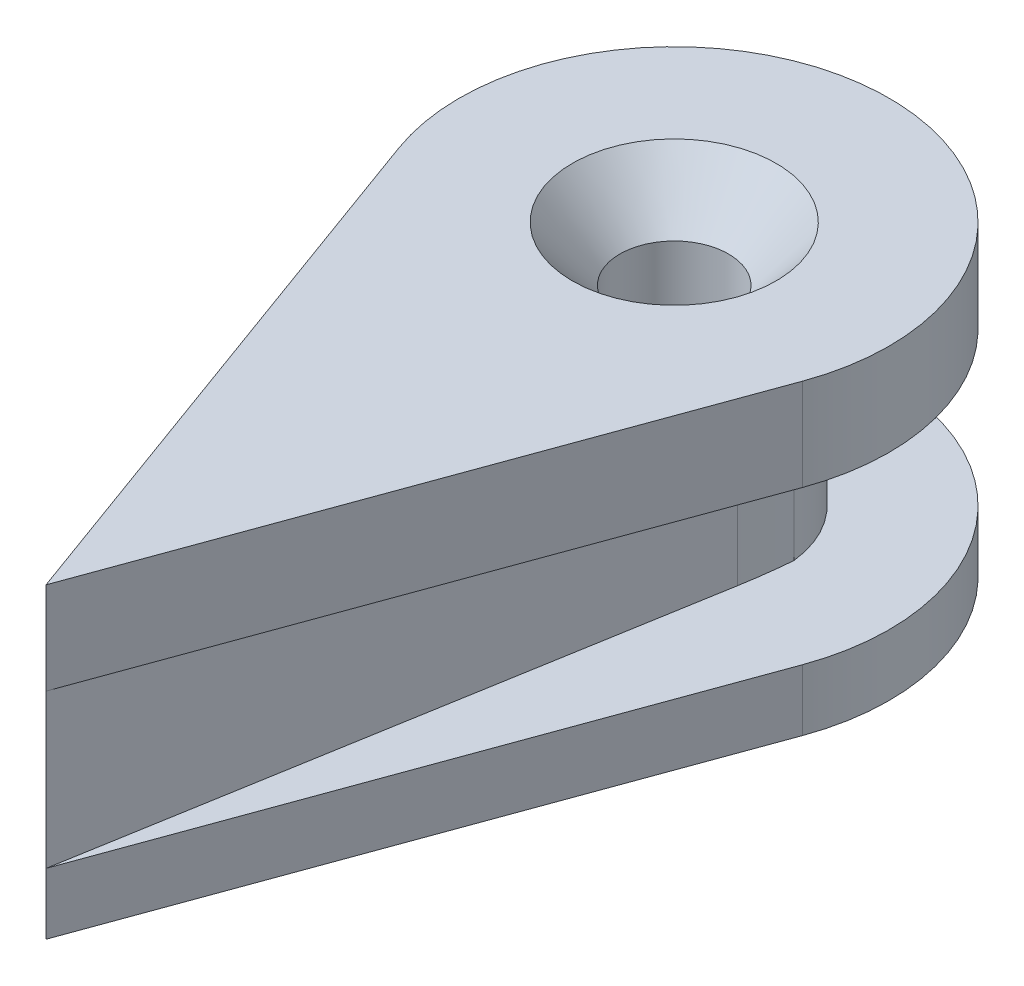
ISO-10303-21;
HEADER;
FILE_DESCRIPTION(('STEP AP214'),'2;1');
FILE_NAME('part.step','',(''),(''),'','','');
FILE_SCHEMA(('AUTOMOTIVE_DESIGN { 1 0 10303 214 1 1 1 1 }'));
ENDSEC;
DATA;
#1=APPLICATION_CONTEXT('core data for automotive mechanical design processes');
#2=APPLICATION_PROTOCOL_DEFINITION('international standard','automotive_design',2000,#1);
#3=PRODUCT_CONTEXT('',#1,'mechanical');
#4=PRODUCT('Part','Part','',(#3));
#5=PRODUCT_RELATED_PRODUCT_CATEGORY('part','',(#4));
#6=PRODUCT_DEFINITION_FORMATION('','',#4);
#7=PRODUCT_DEFINITION_CONTEXT('part definition',#1,'design');
#8=PRODUCT_DEFINITION('design','',#6,#7);
#9=PRODUCT_DEFINITION_SHAPE('','',#8);
#10=(LENGTH_UNIT() NAMED_UNIT(*) SI_UNIT(.MILLI.,.METRE.));
#11=(NAMED_UNIT(*) PLANE_ANGLE_UNIT() SI_UNIT($,.RADIAN.));
#12=(NAMED_UNIT(*) SI_UNIT($,.STERADIAN.) SOLID_ANGLE_UNIT());
#13=UNCERTAINTY_MEASURE_WITH_UNIT(LENGTH_MEASURE(1.E-05),#10,'distance_accuracy_value','');
#14=(GEOMETRIC_REPRESENTATION_CONTEXT(3) GLOBAL_UNCERTAINTY_ASSIGNED_CONTEXT((#13)) GLOBAL_UNIT_ASSIGNED_CONTEXT((#10,
#11,#12)) REPRESENTATION_CONTEXT('',''));
#15=CARTESIAN_POINT('',(0.,0.,0.));
#16=DIRECTION('',(0.,0.,1.));
#17=DIRECTION('',(1.,0.,0.));
#18=AXIS2_PLACEMENT_3D('',#15,#16,#17);
#19=CARTESIAN_POINT('',(0.,12.7,0.));
#20=DIRECTION('',(0.,-1.,0.));
#21=DIRECTION('',(0.,0.,-1.));
#22=AXIS2_PLACEMENT_3D('',#19,#20,#21);
#23=CYLINDRICAL_SURFACE('',#22,8.89);
#24=CARTESIAN_POINT('',(0.,2.54,0.));
#25=DIRECTION('',(0.,1.,0.));
#26=DIRECTION('',(0.,0.,1.));
#27=AXIS2_PLACEMENT_3D('',#24,#25,#26);
#28=CIRCLE('',#27,8.89);
#29=CARTESIAN_POINT('',(8.35386739878674,2.54,3.04055907416517));
#30=VERTEX_POINT('',#29);
#31=CARTESIAN_POINT('',(-8.35386739878674,2.54,3.04055907416517));
#32=VERTEX_POINT('',#31);
#33=EDGE_CURVE('E178',#30,#32,#28,.T.);
#34=ORIENTED_EDGE('',*,*,#33,.F.);
#35=DIRECTION('',(0.,-1.,0.));
#36=VECTOR('',#35,1.);
#37=CARTESIAN_POINT('',(8.35386739878673,12.7,3.04055907416517));
#38=LINE('',#37,#36);
#39=CARTESIAN_POINT('',(8.35386739878673,0.,3.04055907416517));
#40=VERTEX_POINT('',#39);
#41=EDGE_CURVE('E147',#30,#40,#38,.T.);
#42=ORIENTED_EDGE('',*,*,#41,.T.);
#43=CARTESIAN_POINT('',(0.,0.,0.));
#44=DIRECTION('',(0.,1.,0.));
#45=DIRECTION('',(0.,0.,1.));
#46=AXIS2_PLACEMENT_3D('',#43,#44,#45);
#47=CIRCLE('',#46,8.89);
#48=CARTESIAN_POINT('',(-8.35386739878673,0.,3.04055907416517));
#49=VERTEX_POINT('',#48);
#50=EDGE_CURVE('E160',#40,#49,#47,.T.);
#51=ORIENTED_EDGE('',*,*,#50,.T.);
#52=DIRECTION('',(0.,-1.,0.));
#53=VECTOR('',#52,1.);
#54=CARTESIAN_POINT('',(-8.35386739878673,12.7,3.04055907416517));
#55=LINE('',#54,#53);
#56=EDGE_CURVE('E151',#32,#49,#55,.T.);
#57=ORIENTED_EDGE('',*,*,#56,.F.);
#58=EDGE_LOOP('',(#34,#42,#51,#57));
#59=FACE_BOUND('',#58,.T.);
#60=ADVANCED_FACE('F35',(#59),#23,.T.);
#61=CARTESIAN_POINT('',(8.35386739878673,12.7,3.04055907416517));
#62=DIRECTION('',(0.939692620785909,0.,0.342020143325666));
#63=DIRECTION('',(0.342020143325666,0.,-0.939692620785909));
#64=AXIS2_PLACEMENT_3D('',#61,#62,#63);
#65=PLANE('',#64);
#66=ORIENTED_EDGE('',*,*,#41,.F.);
#67=DIRECTION('',(-0.342020143325666,0.,0.939692620785909));
#68=VECTOR('',#67,1.);
#69=CARTESIAN_POINT('',(8.35386739878674,2.54,3.04055907416517));
#70=LINE('',#69,#68);
#71=CARTESIAN_POINT('',(0.,2.54,25.9926211174501));
#72=VERTEX_POINT('',#71);
#73=EDGE_CURVE('E132',#30,#72,#70,.T.);
#74=ORIENTED_EDGE('',*,*,#73,.T.);
#75=DIRECTION('',(0.,-1.,0.));
#76=VECTOR('',#75,1.);
#77=CARTESIAN_POINT('',(0.,12.7,25.99262111745));
#78=LINE('',#77,#76);
#79=CARTESIAN_POINT('',(0.,0.,25.99262111745));
#80=VERTEX_POINT('',#79);
#81=EDGE_CURVE('E155',#72,#80,#78,.T.);
#82=ORIENTED_EDGE('',*,*,#81,.T.);
#83=DIRECTION('',(-0.342020143325666,0.,0.939692620785909));
#84=VECTOR('',#83,1.);
#85=CARTESIAN_POINT('',(8.35386739878673,0.,3.04055907416517));
#86=LINE('',#85,#84);
#87=EDGE_CURVE('E163',#40,#80,#86,.T.);
#88=ORIENTED_EDGE('',*,*,#87,.F.);
#89=EDGE_LOOP('',(#66,#74,#82,#88));
#90=FACE_BOUND('',#89,.T.);
#91=ADVANCED_FACE('F214',(#90),#65,.T.);
#92=CARTESIAN_POINT('',(8.35386739878673,12.7,3.04055907416517));
#93=VERTEX_POINT('',#92);
#94=CARTESIAN_POINT('',(8.35386739878674,8.89,3.04055907416517));
#95=VERTEX_POINT('',#94);
#96=EDGE_CURVE('E144',#93,#95,#38,.T.);
#97=ORIENTED_EDGE('',*,*,#96,.T.);
#98=CARTESIAN_POINT('',(0.,8.89,0.));
#99=DIRECTION('',(0.,1.,0.));
#100=DIRECTION('',(0.,0.,1.));
#101=AXIS2_PLACEMENT_3D('',#98,#99,#100);
#102=CIRCLE('',#101,8.89);
#103=CARTESIAN_POINT('',(-8.35386739878674,8.89,3.04055907416517));
#104=VERTEX_POINT('',#103);
#105=EDGE_CURVE('E184',#95,#104,#102,.T.);
#106=ORIENTED_EDGE('',*,*,#105,.T.);
#107=CARTESIAN_POINT('',(-8.35386739878673,12.7,3.04055907416517));
#108=VERTEX_POINT('',#107);
#109=EDGE_CURVE('E148',#108,#104,#55,.T.);
#110=ORIENTED_EDGE('',*,*,#109,.F.);
#111=CARTESIAN_POINT('',(0.,12.7,0.));
#112=DIRECTION('',(0.,1.,0.));
#113=DIRECTION('',(0.,0.,1.));
#114=AXIS2_PLACEMENT_3D('',#111,#112,#113);
#115=CIRCLE('',#114,8.89);
#116=EDGE_CURVE('E170',#93,#108,#115,.T.);
#117=ORIENTED_EDGE('',*,*,#116,.F.);
#118=EDGE_LOOP('',(#97,#106,#110,#117));
#119=FACE_BOUND('',#118,.T.);
#120=ADVANCED_FACE('F229',(#119),#23,.T.);
#121=CARTESIAN_POINT('',(-8.35386739878674,12.7,3.04055907416517));
#122=DIRECTION('',(-0.939692620785909,0.,0.342020143325666));
#123=DIRECTION('',(0.342020143325666,0.,0.939692620785909));
#124=AXIS2_PLACEMENT_3D('',#121,#122,#123);
#125=PLANE('',#124);
#126=ORIENTED_EDGE('',*,*,#81,.F.);
#127=DIRECTION('',(0.342020143325666,0.,0.939692620785909));
#128=VECTOR('',#127,1.);
#129=CARTESIAN_POINT('',(-8.35386739878674,2.54,3.04055907416517));
#130=LINE('',#129,#128);
#131=EDGE_CURVE('E189',#32,#72,#130,.T.);
#132=ORIENTED_EDGE('',*,*,#131,.F.);
#133=ORIENTED_EDGE('',*,*,#56,.T.);
#134=DIRECTION('',(-0.342020143325666,0.,-0.939692620785909));
#135=VECTOR('',#134,1.);
#136=CARTESIAN_POINT('',(-8.35386739878674,0.,3.04055907416517));
#137=LINE('',#136,#135);
#138=EDGE_CURVE('E156',#80,#49,#137,.T.);
#139=ORIENTED_EDGE('',*,*,#138,.F.);
#140=EDGE_LOOP('',(#126,#132,#133,#139));
#141=FACE_BOUND('',#140,.T.);
#142=ADVANCED_FACE('F222',(#141),#125,.T.);
#143=DIRECTION('',(-0.342020143325666,0.,0.939692620785909));
#144=VECTOR('',#143,1.);
#145=CARTESIAN_POINT('',(8.35386739878674,8.89,3.04055907416517));
#146=LINE('',#145,#144);
#147=CARTESIAN_POINT('',(0.,8.89,25.9926211174501));
#148=VERTEX_POINT('',#147);
#149=EDGE_CURVE('E200',#95,#148,#146,.T.);
#150=ORIENTED_EDGE('',*,*,#149,.F.);
#151=ORIENTED_EDGE('',*,*,#96,.F.);
#152=DIRECTION('',(-0.342020143325666,0.,0.939692620785909));
#153=VECTOR('',#152,1.);
#154=CARTESIAN_POINT('',(8.35386739878673,12.7,3.04055907416517));
#155=LINE('',#154,#153);
#156=CARTESIAN_POINT('',(0.,12.7,25.99262111745));
#157=VERTEX_POINT('',#156);
#158=EDGE_CURVE('E159',#93,#157,#155,.T.);
#159=ORIENTED_EDGE('',*,*,#158,.T.);
#160=EDGE_CURVE('E152',#157,#148,#78,.T.);
#161=ORIENTED_EDGE('',*,*,#160,.T.);
#162=EDGE_LOOP('',(#150,#151,#159,#161));
#163=FACE_BOUND('',#162,.T.);
#164=ADVANCED_FACE('F234',(#163),#65,.T.);
#165=DIRECTION('',(0.342020143325666,0.,0.939692620785909));
#166=VECTOR('',#165,1.);
#167=CARTESIAN_POINT('',(-8.35386739878674,8.89,3.04055907416517));
#168=LINE('',#167,#166);
#169=EDGE_CURVE('E181',#104,#148,#168,.T.);
#170=ORIENTED_EDGE('',*,*,#169,.T.);
#171=ORIENTED_EDGE('',*,*,#160,.F.);
#172=DIRECTION('',(-0.342020143325666,0.,-0.939692620785909));
#173=VECTOR('',#172,1.);
#174=CARTESIAN_POINT('',(-8.35386739878674,12.7,3.04055907416517));
#175=LINE('',#174,#173);
#176=EDGE_CURVE('E167',#157,#108,#175,.T.);
#177=ORIENTED_EDGE('',*,*,#176,.T.);
#178=ORIENTED_EDGE('',*,*,#109,.T.);
#179=EDGE_LOOP('',(#170,#171,#177,#178));
#180=FACE_BOUND('',#179,.T.);
#181=ADVANCED_FACE('F241',(#180),#125,.T.);
#182=CARTESIAN_POINT('',(0.,12.7,0.));
#183=DIRECTION('',(0.,1.,0.));
#184=DIRECTION('',(0.,0.,1.));
#185=AXIS2_PLACEMENT_3D('',#182,#183,#184);
#186=PLANE('',#185);
#187=CARTESIAN_POINT('',(0.,12.7,0.));
#188=DIRECTION('',(0.,1.,0.));
#189=DIRECTION('',(0.,0.,1.));
#190=AXIS2_PLACEMENT_3D('',#187,#188,#189);
#191=CIRCLE('',#190,4.2164);
#192=CARTESIAN_POINT('',(0.,12.7,4.2164));
#193=VERTEX_POINT('',#192);
#194=EDGE_CURVE('E131',#193,#193,#191,.T.);
#195=ORIENTED_EDGE('',*,*,#194,.F.);
#196=EDGE_LOOP('',(#195));
#197=FACE_BOUND('',#196,.T.);
#198=ORIENTED_EDGE('',*,*,#158,.F.);
#199=ORIENTED_EDGE('',*,*,#116,.T.);
#200=ORIENTED_EDGE('',*,*,#176,.F.);
#201=EDGE_LOOP('',(#198,#199,#200));
#202=FACE_BOUND('',#201,.T.);
#203=ADVANCED_FACE('F263',(#197,#202),#186,.T.);
#204=CARTESIAN_POINT('',(0.,0.,0.));
#205=DIRECTION('',(0.,1.,0.));
#206=DIRECTION('',(0.,0.,1.));
#207=AXIS2_PLACEMENT_3D('',#204,#205,#206);
#208=PLANE('',#207);
#209=CARTESIAN_POINT('',(0.,0.,0.));
#210=DIRECTION('',(0.,1.,0.));
#211=DIRECTION('',(0.,0.,1.));
#212=AXIS2_PLACEMENT_3D('',#209,#210,#211);
#213=CIRCLE('',#212,2.2479);
#214=CARTESIAN_POINT('',(0.,0.,2.2479));
#215=VERTEX_POINT('',#214);
#216=EDGE_CURVE('E186',#215,#215,#213,.T.);
#217=ORIENTED_EDGE('',*,*,#216,.T.);
#218=EDGE_LOOP('',(#217));
#219=FACE_BOUND('',#218,.T.);
#220=ORIENTED_EDGE('',*,*,#87,.T.);
#221=ORIENTED_EDGE('',*,*,#138,.T.);
#222=ORIENTED_EDGE('',*,*,#50,.F.);
#223=EDGE_LOOP('',(#220,#221,#222));
#224=FACE_BOUND('',#223,.T.);
#225=ADVANCED_FACE('F225',(#219,#224),#208,.F.);
#226=CARTESIAN_POINT('',(0.,2.54,0.));
#227=DIRECTION('',(0.,1.,0.));
#228=DIRECTION('',(0.,0.,1.));
#229=AXIS2_PLACEMENT_3D('',#226,#227,#228);
#230=CYLINDRICAL_SURFACE('',#229,4.47449303461897);
#231=CARTESIAN_POINT('',(0.,8.89,0.));
#232=DIRECTION('',(0.,1.,0.));
#233=DIRECTION('',(0.,0.,1.));
#234=AXIS2_PLACEMENT_3D('',#231,#232,#233);
#235=CIRCLE('',#234,4.47449303461897);
#236=CARTESIAN_POINT('',(-4.445,8.89,-0.512896594698817));
#237=VERTEX_POINT('',#236);
#238=CARTESIAN_POINT('',(4.445,8.89,-0.512896594698817));
#239=VERTEX_POINT('',#238);
#240=EDGE_CURVE('E129',#237,#239,#235,.F.);
#241=ORIENTED_EDGE('',*,*,#240,.T.);
#242=DIRECTION('',(0.,1.,0.));
#243=VECTOR('',#242,1.);
#244=CARTESIAN_POINT('',(4.445,2.54,-0.512896594698817));
#245=LINE('',#244,#243);
#246=CARTESIAN_POINT('',(4.445,2.54,-0.512896594698817));
#247=VERTEX_POINT('',#246);
#248=EDGE_CURVE('E127',#247,#239,#245,.T.);
#249=ORIENTED_EDGE('',*,*,#248,.F.);
#250=CARTESIAN_POINT('',(0.,2.54,0.));
#251=DIRECTION('',(0.,1.,0.));
#252=DIRECTION('',(0.,0.,1.));
#253=AXIS2_PLACEMENT_3D('',#250,#251,#252);
#254=CIRCLE('',#253,4.47449303461897);
#255=CARTESIAN_POINT('',(-4.445,2.54,-0.512896594698817));
#256=VERTEX_POINT('',#255);
#257=EDGE_CURVE('E111',#256,#247,#254,.F.);
#258=ORIENTED_EDGE('',*,*,#257,.F.);
#259=DIRECTION('',(0.,1.,0.));
#260=VECTOR('',#259,1.);
#261=CARTESIAN_POINT('',(-4.445,2.54,-0.512896594698817));
#262=LINE('',#261,#260);
#263=EDGE_CURVE('E166',#256,#237,#262,.T.);
#264=ORIENTED_EDGE('',*,*,#263,.T.);
#265=EDGE_LOOP('',(#241,#249,#258,#264));
#266=FACE_BOUND('',#265,.T.);
#267=ADVANCED_FACE('F128',(#266),#230,.T.);
#268=CARTESIAN_POINT('',(-4.31870195975043,2.54,0.738541531627338));
#269=DIRECTION('',(0.985690870725842,0.,-0.168563066440226));
#270=DIRECTION('',(-0.168563066440226,0.,-0.985690870725842));
#271=AXIS2_PLACEMENT_3D('',#268,#269,#270);
#272=PLANE('',#271);
#273=DIRECTION('',(-0.168563066440226,0.,-0.985690870725842));
#274=VECTOR('',#273,1.);
#275=CARTESIAN_POINT('',(-4.31870195975043,8.89,0.738541531627338));
#276=LINE('',#275,#274);
#277=CARTESIAN_POINT('',(-4.17726235609697,8.89,1.56562500266596));
#278=VERTEX_POINT('',#277);
#279=EDGE_CURVE('E179',#148,#278,#276,.T.);
#280=ORIENTED_EDGE('',*,*,#279,.T.);
#281=DIRECTION('',(0.,1.,0.));
#282=VECTOR('',#281,1.);
#283=CARTESIAN_POINT('',(-4.17726235609697,2.54,1.56562500266596));
#284=LINE('',#283,#282);
#285=CARTESIAN_POINT('',(-4.17726235609697,2.54,1.56562500266596));
#286=VERTEX_POINT('',#285);
#287=EDGE_CURVE('E50',#278,#286,#284,.F.);
#288=ORIENTED_EDGE('',*,*,#287,.T.);
#289=DIRECTION('',(-0.168563066440226,0.,-0.985690870725842));
#290=VECTOR('',#289,1.);
#291=CARTESIAN_POINT('',(-4.31870195975043,2.54,0.738541531627338));
#292=LINE('',#291,#290);
#293=EDGE_CURVE('E123',#72,#286,#292,.T.);
#294=ORIENTED_EDGE('',*,*,#293,.F.);
#295=DIRECTION('',(0.,1.,0.));
#296=VECTOR('',#295,1.);
#297=CARTESIAN_POINT('',(0.,2.54,25.9926211174501));
#298=LINE('',#297,#296);
#299=EDGE_CURVE('E122',#72,#148,#298,.T.);
#300=ORIENTED_EDGE('',*,*,#299,.T.);
#301=EDGE_LOOP('',(#280,#288,#294,#300));
#302=FACE_BOUND('',#301,.T.);
#303=ADVANCED_FACE('F217',(#302),#272,.F.);
#304=CARTESIAN_POINT('',(0.,2.54,0.));
#305=DIRECTION('',(0.,1.,0.));
#306=DIRECTION('',(0.,0.,1.));
#307=AXIS2_PLACEMENT_3D('',#304,#305,#306);
#308=PLANE('',#307);
#309=ORIENTED_EDGE('',*,*,#257,.T.);
#310=CARTESIAN_POINT('',(-20.8592857603394,2.54,-2.71587688491579));
#311=DIRECTION('',(0.,1.,0.));
#312=DIRECTION('',(0.,0.,1.));
#313=AXIS2_PLACEMENT_3D('',#310,#311,#312);
#314=CIRCLE('',#313,25.4);
#315=CARTESIAN_POINT('',(4.17726235609697,2.54,1.56562500266596));
#316=VERTEX_POINT('',#315);
#317=EDGE_CURVE('E116',#247,#316,#314,.F.);
#318=ORIENTED_EDGE('',*,*,#317,.T.);
#319=DIRECTION('',(0.168563066440226,0.,-0.985690870725842));
#320=VECTOR('',#319,1.);
#321=CARTESIAN_POINT('',(4.31870195975043,2.54,0.738541531627338));
#322=LINE('',#321,#320);
#323=EDGE_CURVE('E202',#72,#316,#322,.T.);
#324=ORIENTED_EDGE('',*,*,#323,.F.);
#325=ORIENTED_EDGE('',*,*,#73,.F.);
#326=ORIENTED_EDGE('',*,*,#33,.T.);
#327=ORIENTED_EDGE('',*,*,#131,.T.);
#328=ORIENTED_EDGE('',*,*,#293,.T.);
#329=CARTESIAN_POINT('',(20.8592857603394,2.54,-2.71587688491579));
#330=DIRECTION('',(0.,1.,0.));
#331=DIRECTION('',(0.,0.,1.));
#332=AXIS2_PLACEMENT_3D('',#329,#330,#331);
#333=CIRCLE('',#332,25.4);
#334=EDGE_CURVE('E11',#286,#256,#333,.F.);
#335=ORIENTED_EDGE('',*,*,#334,.T.);
#336=EDGE_LOOP('',(#309,#318,#324,#325,#326,#327,#328,#335));
#337=FACE_BOUND('',#336,.T.);
#338=ADVANCED_FACE('F113',(#337),#308,.T.);
#339=CARTESIAN_POINT('',(0.,8.89,0.));
#340=DIRECTION('',(0.,1.,0.));
#341=DIRECTION('',(0.,0.,1.));
#342=AXIS2_PLACEMENT_3D('',#339,#340,#341);
#343=PLANE('',#342);
#344=ORIENTED_EDGE('',*,*,#105,.F.);
#345=ORIENTED_EDGE('',*,*,#149,.T.);
#346=DIRECTION('',(0.168563066440226,0.,-0.985690870725842));
#347=VECTOR('',#346,1.);
#348=CARTESIAN_POINT('',(4.31870195975043,8.89,0.738541531627338));
#349=LINE('',#348,#347);
#350=CARTESIAN_POINT('',(4.17726235609697,8.89,1.56562500266596));
#351=VERTEX_POINT('',#350);
#352=EDGE_CURVE('E203',#148,#351,#349,.T.);
#353=ORIENTED_EDGE('',*,*,#352,.T.);
#354=CARTESIAN_POINT('',(-20.8592857603394,8.89,-2.71587688491579));
#355=DIRECTION('',(0.,1.,0.));
#356=DIRECTION('',(0.,0.,1.));
#357=AXIS2_PLACEMENT_3D('',#354,#355,#356);
#358=CIRCLE('',#357,25.4);
#359=EDGE_CURVE('E138',#351,#239,#358,.T.);
#360=ORIENTED_EDGE('',*,*,#359,.T.);
#361=ORIENTED_EDGE('',*,*,#240,.F.);
#362=CARTESIAN_POINT('',(20.8592857603394,8.89,-2.71587688491579));
#363=DIRECTION('',(0.,1.,0.));
#364=DIRECTION('',(0.,0.,1.));
#365=AXIS2_PLACEMENT_3D('',#362,#363,#364);
#366=CIRCLE('',#365,25.4);
#367=EDGE_CURVE('E43',#237,#278,#366,.T.);
#368=ORIENTED_EDGE('',*,*,#367,.T.);
#369=ORIENTED_EDGE('',*,*,#279,.F.);
#370=ORIENTED_EDGE('',*,*,#169,.F.);
#371=EDGE_LOOP('',(#344,#345,#353,#360,#361,#368,#369,#370));
#372=FACE_BOUND('',#371,.T.);
#373=ADVANCED_FACE('F248',(#372),#343,.F.);
#374=CARTESIAN_POINT('',(0.,12.7,0.));
#375=DIRECTION('',(0.,1.,0.));
#376=DIRECTION('',(0.,0.,1.));
#377=AXIS2_PLACEMENT_3D('',#374,#375,#376);
#378=CYLINDRICAL_SURFACE('',#377,2.2479);
#379=ORIENTED_EDGE('',*,*,#216,.F.);
#380=EDGE_LOOP('',(#379));
#381=FACE_BOUND('',#380,.T.);
#382=CARTESIAN_POINT('',(0.,10.4354997903854,0.));
#383=DIRECTION('',(0.,1.,0.));
#384=DIRECTION('',(0.,0.,1.));
#385=AXIS2_PLACEMENT_3D('',#382,#383,#384);
#386=CIRCLE('',#385,2.2479);
#387=CARTESIAN_POINT('',(0.,10.4354997903854,2.2479));
#388=VERTEX_POINT('',#387);
#389=EDGE_CURVE('E195',#388,#388,#386,.T.);
#390=ORIENTED_EDGE('',*,*,#389,.T.);
#391=EDGE_LOOP('',(#390));
#392=FACE_BOUND('',#391,.T.);
#393=ADVANCED_FACE('F280',(#381,#392),#378,.F.);
#394=CARTESIAN_POINT('',(0.,12.7,0.));
#395=DIRECTION('',(0.,1.,0.));
#396=DIRECTION('',(0.,0.,1.));
#397=AXIS2_PLACEMENT_3D('',#394,#395,#396);
#398=CONICAL_SURFACE('',#397,4.2164,0.715584993317675);
#399=ORIENTED_EDGE('',*,*,#389,.F.);
#400=EDGE_LOOP('',(#399));
#401=FACE_BOUND('',#400,.T.);
#402=ORIENTED_EDGE('',*,*,#194,.T.);
#403=EDGE_LOOP('',(#402));
#404=FACE_BOUND('',#403,.T.);
#405=ADVANCED_FACE('F257',(#401,#404),#398,.F.);
#406=CARTESIAN_POINT('',(4.31870195975043,2.54,0.738541531627338));
#407=DIRECTION('',(0.985690870725842,0.,0.168563066440226));
#408=DIRECTION('',(0.168563066440226,0.,-0.985690870725842));
#409=AXIS2_PLACEMENT_3D('',#406,#407,#408);
#410=PLANE('',#409);
#411=ORIENTED_EDGE('',*,*,#323,.T.);
#412=DIRECTION('',(0.,-1.,0.));
#413=VECTOR('',#412,1.);
#414=CARTESIAN_POINT('',(4.17726235609697,8.89,1.56562500266596));
#415=LINE('',#414,#413);
#416=EDGE_CURVE('E137',#316,#351,#415,.F.);
#417=ORIENTED_EDGE('',*,*,#416,.T.);
#418=ORIENTED_EDGE('',*,*,#352,.F.);
#419=ORIENTED_EDGE('',*,*,#299,.F.);
#420=EDGE_LOOP('',(#411,#417,#418,#419));
#421=FACE_BOUND('',#420,.T.);
#422=ADVANCED_FACE('F209',(#421),#410,.T.);
#423=CARTESIAN_POINT('',(-20.8592857603394,2.54,-2.71587688491579));
#424=DIRECTION('',(0.,1.,0.));
#425=DIRECTION('',(0.,0.,1.));
#426=AXIS2_PLACEMENT_3D('',#423,#424,#425);
#427=CYLINDRICAL_SURFACE('',#426,25.4);
#428=ORIENTED_EDGE('',*,*,#317,.F.);
#429=ORIENTED_EDGE('',*,*,#248,.T.);
#430=ORIENTED_EDGE('',*,*,#359,.F.);
#431=ORIENTED_EDGE('',*,*,#416,.F.);
#432=EDGE_LOOP('',(#428,#429,#430,#431));
#433=FACE_BOUND('',#432,.T.);
#434=ADVANCED_FACE('F135',(#433),#427,.T.);
#435=CARTESIAN_POINT('',(20.8592857603394,2.54,-2.71587688491579));
#436=DIRECTION('',(0.,1.,0.));
#437=DIRECTION('',(0.,0.,1.));
#438=AXIS2_PLACEMENT_3D('',#435,#436,#437);
#439=CYLINDRICAL_SURFACE('',#438,25.4);
#440=ORIENTED_EDGE('',*,*,#334,.F.);
#441=ORIENTED_EDGE('',*,*,#287,.F.);
#442=ORIENTED_EDGE('',*,*,#367,.F.);
#443=ORIENTED_EDGE('',*,*,#263,.F.);
#444=EDGE_LOOP('',(#440,#441,#442,#443));
#445=FACE_BOUND('',#444,.T.);
#446=ADVANCED_FACE('F37',(#445),#439,.T.);
#447=CLOSED_SHELL('',(#60,#91,#120,#142,#164,#181,#203,#225,#267,#303,#338,#373,#393,#405,#422,
#434,#446));
#448=MANIFOLD_SOLID_BREP('B2',#447);
#449=ADVANCED_BREP_SHAPE_REPRESENTATION('',(#18,#448),#14);
#450=SHAPE_DEFINITION_REPRESENTATION(#9,#449);
ENDSEC;
END-ISO-10303-21;
